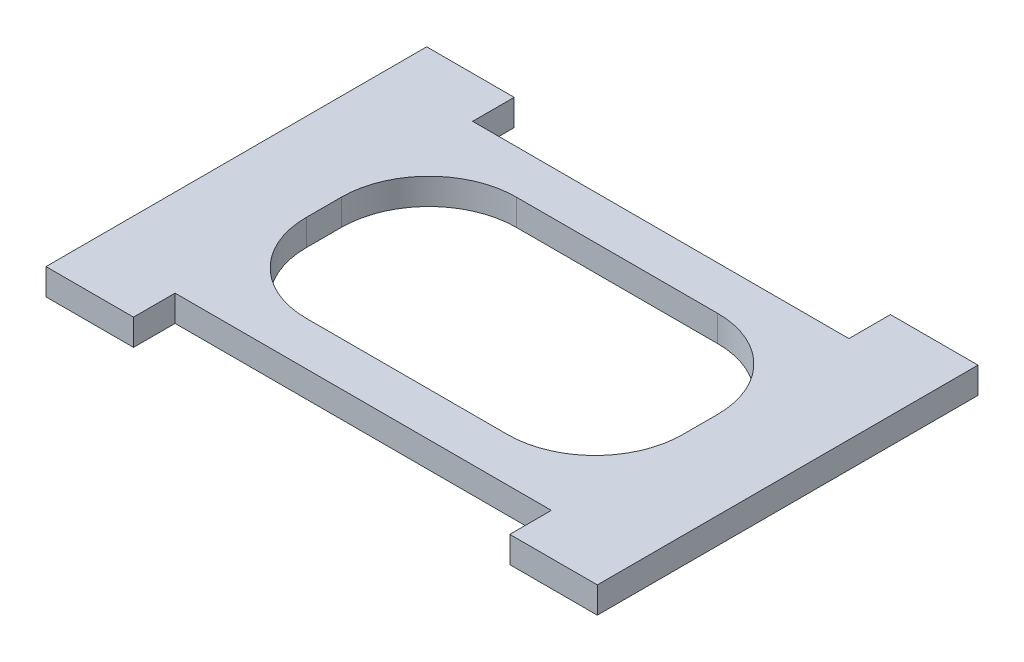
ISO-10303-21;
HEADER;
FILE_DESCRIPTION(('STEP AP214'),'2;1');
FILE_NAME('part.step','',(''),(''),'','','');
FILE_SCHEMA(('AUTOMOTIVE_DESIGN { 1 0 10303 214 1 1 1 1 }'));
ENDSEC;
DATA;
#1=APPLICATION_CONTEXT('core data for automotive mechanical design processes');
#2=APPLICATION_PROTOCOL_DEFINITION('international standard','automotive_design',2000,#1);
#3=PRODUCT_CONTEXT('',#1,'mechanical');
#4=PRODUCT('Part','Part','',(#3));
#5=PRODUCT_RELATED_PRODUCT_CATEGORY('part','',(#4));
#6=PRODUCT_DEFINITION_FORMATION('','',#4);
#7=PRODUCT_DEFINITION_CONTEXT('part definition',#1,'design');
#8=PRODUCT_DEFINITION('design','',#6,#7);
#9=PRODUCT_DEFINITION_SHAPE('','',#8);
#10=(LENGTH_UNIT() NAMED_UNIT(*) SI_UNIT(.MILLI.,.METRE.));
#11=(NAMED_UNIT(*) PLANE_ANGLE_UNIT() SI_UNIT($,.RADIAN.));
#12=(NAMED_UNIT(*) SI_UNIT($,.STERADIAN.) SOLID_ANGLE_UNIT());
#13=UNCERTAINTY_MEASURE_WITH_UNIT(LENGTH_MEASURE(1.E-05),#10,'distance_accuracy_value','');
#14=(GEOMETRIC_REPRESENTATION_CONTEXT(3) GLOBAL_UNCERTAINTY_ASSIGNED_CONTEXT((#13)) GLOBAL_UNIT_ASSIGNED_CONTEXT((#10,
#11,#12)) REPRESENTATION_CONTEXT('',''));
#15=CARTESIAN_POINT('',(0.,0.,0.));
#16=DIRECTION('',(0.,0.,1.));
#17=DIRECTION('',(1.,0.,0.));
#18=AXIS2_PLACEMENT_3D('',#15,#16,#17);
#19=CARTESIAN_POINT('',(2.75000000000301,3.,0.));
#20=DIRECTION('',(-1.,0.,0.));
#21=DIRECTION('',(0.,0.,1.));
#22=AXIS2_PLACEMENT_3D('',#19,#20,#21);
#23=PLANE('',#22);
#24=DIRECTION('',(0.,0.,-1.));
#25=VECTOR('',#24,1.);
#26=CARTESIAN_POINT('',(2.75000000000301,0.,0.));
#27=LINE('',#26,#25);
#28=CARTESIAN_POINT('',(2.75000000000301,0.,-16.9999999999987));
#29=VERTEX_POINT('',#28);
#30=CARTESIAN_POINT('',(2.75000000000301,0.,-21.7499999999987));
#31=VERTEX_POINT('',#30);
#32=EDGE_CURVE('E185',#29,#31,#27,.T.);
#33=ORIENTED_EDGE('',*,*,#32,.F.);
#34=DIRECTION('',(0.,-1.,0.));
#35=VECTOR('',#34,1.);
#36=CARTESIAN_POINT('',(2.75000000000301,3.,-16.9999999999987));
#37=LINE('',#36,#35);
#38=CARTESIAN_POINT('',(2.75000000000301,3.,-16.9999999999987));
#39=VERTEX_POINT('',#38);
#40=EDGE_CURVE('E179',#39,#29,#37,.T.);
#41=ORIENTED_EDGE('',*,*,#40,.F.);
#42=DIRECTION('',(0.,0.,-1.));
#43=VECTOR('',#42,1.);
#44=CARTESIAN_POINT('',(2.75000000000301,3.,0.));
#45=LINE('',#44,#43);
#46=CARTESIAN_POINT('',(2.75000000000301,3.,-21.7499999999987));
#47=VERTEX_POINT('',#46);
#48=EDGE_CURVE('E182',#39,#47,#45,.T.);
#49=ORIENTED_EDGE('',*,*,#48,.T.);
#50=DIRECTION('',(0.,-1.,0.));
#51=VECTOR('',#50,1.);
#52=CARTESIAN_POINT('',(2.75000000000301,3.,-21.7499999999987));
#53=LINE('',#52,#51);
#54=EDGE_CURVE('E249',#47,#31,#53,.T.);
#55=ORIENTED_EDGE('',*,*,#54,.T.);
#56=EDGE_LOOP('',(#33,#41,#49,#55));
#57=FACE_BOUND('',#56,.T.);
#58=ADVANCED_FACE('F40',(#57),#23,.T.);
#59=CARTESIAN_POINT('',(0.,3.,-16.9999999999987));
#60=DIRECTION('',(0.,0.,1.));
#61=DIRECTION('',(1.,0.,0.));
#62=AXIS2_PLACEMENT_3D('',#59,#60,#61);
#63=PLANE('',#62);
#64=DIRECTION('',(-1.,0.,0.));
#65=VECTOR('',#64,1.);
#66=CARTESIAN_POINT('',(0.,0.,-16.9999999999987));
#67=LINE('',#66,#65);
#68=CARTESIAN_POINT('',(-40.249999999997,0.,-16.9999999999987));
#69=VERTEX_POINT('',#68);
#70=EDGE_CURVE('E252',#29,#69,#67,.T.);
#71=ORIENTED_EDGE('',*,*,#70,.T.);
#72=DIRECTION('',(0.,-1.,0.));
#73=VECTOR('',#72,1.);
#74=CARTESIAN_POINT('',(-40.249999999997,3.,-16.9999999999987));
#75=LINE('',#74,#73);
#76=CARTESIAN_POINT('',(-40.249999999997,3.,-16.9999999999987));
#77=VERTEX_POINT('',#76);
#78=EDGE_CURVE('E190',#77,#69,#75,.T.);
#79=ORIENTED_EDGE('',*,*,#78,.F.);
#80=DIRECTION('',(-1.,0.,0.));
#81=VECTOR('',#80,1.);
#82=CARTESIAN_POINT('',(0.,3.,-16.9999999999987));
#83=LINE('',#82,#81);
#84=EDGE_CURVE('E193',#39,#77,#83,.T.);
#85=ORIENTED_EDGE('',*,*,#84,.F.);
#86=ORIENTED_EDGE('',*,*,#40,.T.);
#87=EDGE_LOOP('',(#71,#79,#85,#86));
#88=FACE_BOUND('',#87,.T.);
#89=ADVANCED_FACE('F194',(#88),#63,.F.);
#90=CARTESIAN_POINT('',(-40.249999999997,3.,0.));
#91=DIRECTION('',(-1.,0.,0.));
#92=DIRECTION('',(0.,0.,1.));
#93=AXIS2_PLACEMENT_3D('',#90,#91,#92);
#94=PLANE('',#93);
#95=DIRECTION('',(0.,0.,-1.));
#96=VECTOR('',#95,1.);
#97=CARTESIAN_POINT('',(-40.249999999997,0.,0.));
#98=LINE('',#97,#96);
#99=CARTESIAN_POINT('',(-40.249999999997,0.,-21.7499999999987));
#100=VERTEX_POINT('',#99);
#101=EDGE_CURVE('E256',#69,#100,#98,.T.);
#102=ORIENTED_EDGE('',*,*,#101,.T.);
#103=DIRECTION('',(0.,-1.,0.));
#104=VECTOR('',#103,1.);
#105=CARTESIAN_POINT('',(-40.249999999997,3.,-21.7499999999987));
#106=LINE('',#105,#104);
#107=CARTESIAN_POINT('',(-40.249999999997,3.,-21.7499999999987));
#108=VERTEX_POINT('',#107);
#109=EDGE_CURVE('E317',#108,#100,#106,.T.);
#110=ORIENTED_EDGE('',*,*,#109,.F.);
#111=DIRECTION('',(0.,0.,-1.));
#112=VECTOR('',#111,1.);
#113=CARTESIAN_POINT('',(-40.249999999997,3.,0.));
#114=LINE('',#113,#112);
#115=EDGE_CURVE('E199',#77,#108,#114,.T.);
#116=ORIENTED_EDGE('',*,*,#115,.F.);
#117=ORIENTED_EDGE('',*,*,#78,.T.);
#118=EDGE_LOOP('',(#102,#110,#116,#117));
#119=FACE_BOUND('',#118,.T.);
#120=ADVANCED_FACE('F428',(#119),#94,.F.);
#121=CARTESIAN_POINT('',(0.,3.,-21.7499999999987));
#122=DIRECTION('',(0.,0.,-1.));
#123=DIRECTION('',(-1.,0.,0.));
#124=AXIS2_PLACEMENT_3D('',#121,#122,#123);
#125=PLANE('',#124);
#126=DIRECTION('',(1.,0.,0.));
#127=VECTOR('',#126,1.);
#128=CARTESIAN_POINT('',(0.,0.,-21.7499999999987));
#129=LINE('',#128,#127);
#130=CARTESIAN_POINT('',(-50.249999999997,0.,-21.7499999999987));
#131=VERTEX_POINT('',#130);
#132=EDGE_CURVE('E260',#131,#100,#129,.T.);
#133=ORIENTED_EDGE('',*,*,#132,.F.);
#134=DIRECTION('',(0.,-1.,0.));
#135=VECTOR('',#134,1.);
#136=CARTESIAN_POINT('',(-50.249999999997,3.,-21.7499999999987));
#137=LINE('',#136,#135);
#138=CARTESIAN_POINT('',(-50.249999999997,3.,-21.7499999999987));
#139=VERTEX_POINT('',#138);
#140=EDGE_CURVE('E314',#139,#131,#137,.T.);
#141=ORIENTED_EDGE('',*,*,#140,.F.);
#142=DIRECTION('',(1.,0.,0.));
#143=VECTOR('',#142,1.);
#144=CARTESIAN_POINT('',(0.,3.,-21.7499999999987));
#145=LINE('',#144,#143);
#146=EDGE_CURVE('E218',#139,#108,#145,.T.);
#147=ORIENTED_EDGE('',*,*,#146,.T.);
#148=ORIENTED_EDGE('',*,*,#109,.T.);
#149=EDGE_LOOP('',(#133,#141,#147,#148));
#150=FACE_BOUND('',#149,.T.);
#151=ADVANCED_FACE('F487',(#150),#125,.T.);
#152=CARTESIAN_POINT('',(-50.249999999997,3.,0.));
#153=DIRECTION('',(-1.,0.,0.));
#154=DIRECTION('',(0.,0.,1.));
#155=AXIS2_PLACEMENT_3D('',#152,#153,#154);
#156=PLANE('',#155);
#157=DIRECTION('',(0.,0.,-1.));
#158=VECTOR('',#157,1.);
#159=CARTESIAN_POINT('',(-50.249999999997,0.,0.));
#160=LINE('',#159,#158);
#161=CARTESIAN_POINT('',(-50.249999999997,0.,21.7500000000004));
#162=VERTEX_POINT('',#161);
#163=EDGE_CURVE('E264',#162,#131,#160,.T.);
#164=ORIENTED_EDGE('',*,*,#163,.F.);
#165=DIRECTION('',(0.,-1.,0.));
#166=VECTOR('',#165,1.);
#167=CARTESIAN_POINT('',(-50.249999999997,3.,21.7500000000004));
#168=LINE('',#167,#166);
#169=CARTESIAN_POINT('',(-50.249999999997,3.,21.7500000000004));
#170=VERTEX_POINT('',#169);
#171=EDGE_CURVE('E311',#170,#162,#168,.T.);
#172=ORIENTED_EDGE('',*,*,#171,.F.);
#173=DIRECTION('',(0.,0.,-1.));
#174=VECTOR('',#173,1.);
#175=CARTESIAN_POINT('',(-50.249999999997,3.,0.));
#176=LINE('',#175,#174);
#177=EDGE_CURVE('E222',#170,#139,#176,.T.);
#178=ORIENTED_EDGE('',*,*,#177,.T.);
#179=ORIENTED_EDGE('',*,*,#140,.T.);
#180=EDGE_LOOP('',(#164,#172,#178,#179));
#181=FACE_BOUND('',#180,.T.);
#182=ADVANCED_FACE('F483',(#181),#156,.T.);
#183=CARTESIAN_POINT('',(0.,3.,21.7500000000004));
#184=DIRECTION('',(0.,0.,-1.));
#185=DIRECTION('',(-1.,0.,0.));
#186=AXIS2_PLACEMENT_3D('',#183,#184,#185);
#187=PLANE('',#186);
#188=DIRECTION('',(1.,0.,0.));
#189=VECTOR('',#188,1.);
#190=CARTESIAN_POINT('',(0.,0.,21.7500000000004));
#191=LINE('',#190,#189);
#192=CARTESIAN_POINT('',(-40.249999999997,0.,21.7500000000004));
#193=VERTEX_POINT('',#192);
#194=EDGE_CURVE('E268',#162,#193,#191,.T.);
#195=ORIENTED_EDGE('',*,*,#194,.T.);
#196=DIRECTION('',(0.,-1.,0.));
#197=VECTOR('',#196,1.);
#198=CARTESIAN_POINT('',(-40.249999999997,3.,21.7500000000004));
#199=LINE('',#198,#197);
#200=CARTESIAN_POINT('',(-40.249999999997,3.,21.7500000000004));
#201=VERTEX_POINT('',#200);
#202=EDGE_CURVE('E308',#201,#193,#199,.T.);
#203=ORIENTED_EDGE('',*,*,#202,.F.);
#204=DIRECTION('',(1.,0.,0.));
#205=VECTOR('',#204,1.);
#206=CARTESIAN_POINT('',(0.,3.,21.7500000000004));
#207=LINE('',#206,#205);
#208=EDGE_CURVE('E226',#170,#201,#207,.T.);
#209=ORIENTED_EDGE('',*,*,#208,.F.);
#210=ORIENTED_EDGE('',*,*,#171,.T.);
#211=EDGE_LOOP('',(#195,#203,#209,#210));
#212=FACE_BOUND('',#211,.T.);
#213=ADVANCED_FACE('F479',(#212),#187,.F.);
#214=CARTESIAN_POINT('',(-40.249999999997,3.,0.));
#215=DIRECTION('',(1.,0.,0.));
#216=DIRECTION('',(0.,0.,-1.));
#217=AXIS2_PLACEMENT_3D('',#214,#215,#216);
#218=PLANE('',#217);
#219=DIRECTION('',(0.,0.,1.));
#220=VECTOR('',#219,1.);
#221=CARTESIAN_POINT('',(-40.249999999997,0.,0.));
#222=LINE('',#221,#220);
#223=CARTESIAN_POINT('',(-40.249999999997,0.,17.0000000000004));
#224=VERTEX_POINT('',#223);
#225=EDGE_CURVE('E272',#224,#193,#222,.T.);
#226=ORIENTED_EDGE('',*,*,#225,.F.);
#227=DIRECTION('',(0.,-1.,0.));
#228=VECTOR('',#227,1.);
#229=CARTESIAN_POINT('',(-40.249999999997,3.,17.0000000000004));
#230=LINE('',#229,#228);
#231=CARTESIAN_POINT('',(-40.249999999997,3.,17.0000000000004));
#232=VERTEX_POINT('',#231);
#233=EDGE_CURVE('E305',#232,#224,#230,.T.);
#234=ORIENTED_EDGE('',*,*,#233,.F.);
#235=DIRECTION('',(0.,0.,1.));
#236=VECTOR('',#235,1.);
#237=CARTESIAN_POINT('',(-40.249999999997,3.,0.));
#238=LINE('',#237,#236);
#239=EDGE_CURVE('E229',#232,#201,#238,.T.);
#240=ORIENTED_EDGE('',*,*,#239,.T.);
#241=ORIENTED_EDGE('',*,*,#202,.T.);
#242=EDGE_LOOP('',(#226,#234,#240,#241));
#243=FACE_BOUND('',#242,.T.);
#244=ADVANCED_FACE('F475',(#243),#218,.T.);
#245=CARTESIAN_POINT('',(0.,3.,17.0000000000003));
#246=DIRECTION('',(0.,0.,1.));
#247=DIRECTION('',(1.,0.,0.));
#248=AXIS2_PLACEMENT_3D('',#245,#246,#247);
#249=PLANE('',#248);
#250=DIRECTION('',(-1.,0.,0.));
#251=VECTOR('',#250,1.);
#252=CARTESIAN_POINT('',(0.,0.,17.0000000000003));
#253=LINE('',#252,#251);
#254=CARTESIAN_POINT('',(2.75000000000299,0.,17.0000000000003));
#255=VERTEX_POINT('',#254);
#256=EDGE_CURVE('E276',#255,#224,#253,.T.);
#257=ORIENTED_EDGE('',*,*,#256,.F.);
#258=DIRECTION('',(0.,-1.,0.));
#259=VECTOR('',#258,1.);
#260=CARTESIAN_POINT('',(2.75000000000299,3.,17.0000000000003));
#261=LINE('',#260,#259);
#262=CARTESIAN_POINT('',(2.75000000000299,3.,17.0000000000003));
#263=VERTEX_POINT('',#262);
#264=EDGE_CURVE('E302',#263,#255,#261,.T.);
#265=ORIENTED_EDGE('',*,*,#264,.F.);
#266=DIRECTION('',(-1.,0.,0.));
#267=VECTOR('',#266,1.);
#268=CARTESIAN_POINT('',(0.,3.,17.0000000000003));
#269=LINE('',#268,#267);
#270=EDGE_CURVE('E233',#263,#232,#269,.T.);
#271=ORIENTED_EDGE('',*,*,#270,.T.);
#272=ORIENTED_EDGE('',*,*,#233,.T.);
#273=EDGE_LOOP('',(#257,#265,#271,#272));
#274=FACE_BOUND('',#273,.T.);
#275=ADVANCED_FACE('F471',(#274),#249,.T.);
#276=CARTESIAN_POINT('',(2.75000000000298,3.,0.));
#277=DIRECTION('',(1.,0.,0.));
#278=DIRECTION('',(0.,0.,-1.));
#279=AXIS2_PLACEMENT_3D('',#276,#277,#278);
#280=PLANE('',#279);
#281=DIRECTION('',(0.,0.,1.));
#282=VECTOR('',#281,1.);
#283=CARTESIAN_POINT('',(2.75000000000298,0.,0.));
#284=LINE('',#283,#282);
#285=CARTESIAN_POINT('',(2.75000000000299,0.,21.7500000000003));
#286=VERTEX_POINT('',#285);
#287=EDGE_CURVE('E280',#255,#286,#284,.T.);
#288=ORIENTED_EDGE('',*,*,#287,.T.);
#289=DIRECTION('',(0.,-1.,0.));
#290=VECTOR('',#289,1.);
#291=CARTESIAN_POINT('',(2.75000000000299,3.,21.7500000000003));
#292=LINE('',#291,#290);
#293=CARTESIAN_POINT('',(2.75000000000299,3.,21.7500000000003));
#294=VERTEX_POINT('',#293);
#295=EDGE_CURVE('E298',#294,#286,#292,.T.);
#296=ORIENTED_EDGE('',*,*,#295,.F.);
#297=DIRECTION('',(0.,0.,1.));
#298=VECTOR('',#297,1.);
#299=CARTESIAN_POINT('',(2.75000000000298,3.,0.));
#300=LINE('',#299,#298);
#301=EDGE_CURVE('E237',#263,#294,#300,.T.);
#302=ORIENTED_EDGE('',*,*,#301,.F.);
#303=ORIENTED_EDGE('',*,*,#264,.T.);
#304=EDGE_LOOP('',(#288,#296,#302,#303));
#305=FACE_BOUND('',#304,.T.);
#306=ADVANCED_FACE('F467',(#305),#280,.F.);
#307=CARTESIAN_POINT('',(0.,3.,21.7500000000003));
#308=DIRECTION('',(0.,0.,-1.));
#309=DIRECTION('',(-1.,0.,0.));
#310=AXIS2_PLACEMENT_3D('',#307,#308,#309);
#311=PLANE('',#310);
#312=DIRECTION('',(1.,0.,0.));
#313=VECTOR('',#312,1.);
#314=CARTESIAN_POINT('',(0.,0.,21.7500000000003));
#315=LINE('',#314,#313);
#316=CARTESIAN_POINT('',(12.750000000003,0.,21.7500000000003));
#317=VERTEX_POINT('',#316);
#318=EDGE_CURVE('E283',#286,#317,#315,.T.);
#319=ORIENTED_EDGE('',*,*,#318,.T.);
#320=DIRECTION('',(0.,-1.,0.));
#321=VECTOR('',#320,1.);
#322=CARTESIAN_POINT('',(12.750000000003,3.,21.7500000000003));
#323=LINE('',#322,#321);
#324=CARTESIAN_POINT('',(12.750000000003,3.,21.7500000000003));
#325=VERTEX_POINT('',#324);
#326=EDGE_CURVE('E295',#325,#317,#323,.T.);
#327=ORIENTED_EDGE('',*,*,#326,.F.);
#328=DIRECTION('',(1.,0.,0.));
#329=VECTOR('',#328,1.);
#330=CARTESIAN_POINT('',(0.,3.,21.7500000000003));
#331=LINE('',#330,#329);
#332=EDGE_CURVE('E240',#294,#325,#331,.T.);
#333=ORIENTED_EDGE('',*,*,#332,.F.);
#334=ORIENTED_EDGE('',*,*,#295,.T.);
#335=EDGE_LOOP('',(#319,#327,#333,#334));
#336=FACE_BOUND('',#335,.T.);
#337=ADVANCED_FACE('F463',(#336),#311,.F.);
#338=CARTESIAN_POINT('',(12.750000000003,3.,0.));
#339=DIRECTION('',(1.,0.,0.));
#340=DIRECTION('',(0.,0.,-1.));
#341=AXIS2_PLACEMENT_3D('',#338,#339,#340);
#342=PLANE('',#341);
#343=DIRECTION('',(0.,0.,1.));
#344=VECTOR('',#343,1.);
#345=CARTESIAN_POINT('',(12.750000000003,0.,0.));
#346=LINE('',#345,#344);
#347=CARTESIAN_POINT('',(12.750000000003,0.,-21.7499999999987));
#348=VERTEX_POINT('',#347);
#349=EDGE_CURVE('E210',#348,#317,#346,.T.);
#350=ORIENTED_EDGE('',*,*,#349,.F.);
#351=DIRECTION('',(0.,-1.,0.));
#352=VECTOR('',#351,1.);
#353=CARTESIAN_POINT('',(12.750000000003,3.,-21.7499999999987));
#354=LINE('',#353,#352);
#355=CARTESIAN_POINT('',(12.750000000003,3.,-21.7499999999987));
#356=VERTEX_POINT('',#355);
#357=EDGE_CURVE('E292',#356,#348,#354,.T.);
#358=ORIENTED_EDGE('',*,*,#357,.F.);
#359=DIRECTION('',(0.,0.,1.));
#360=VECTOR('',#359,1.);
#361=CARTESIAN_POINT('',(12.750000000003,3.,0.));
#362=LINE('',#361,#360);
#363=EDGE_CURVE('E243',#356,#325,#362,.T.);
#364=ORIENTED_EDGE('',*,*,#363,.T.);
#365=ORIENTED_EDGE('',*,*,#326,.T.);
#366=EDGE_LOOP('',(#350,#358,#364,#365));
#367=FACE_BOUND('',#366,.T.);
#368=ADVANCED_FACE('F459',(#367),#342,.T.);
#369=CARTESIAN_POINT('',(0.,3.,-21.7499999999987));
#370=DIRECTION('',(0.,0.,-1.));
#371=DIRECTION('',(-1.,0.,0.));
#372=AXIS2_PLACEMENT_3D('',#369,#370,#371);
#373=PLANE('',#372);
#374=DIRECTION('',(1.,0.,0.));
#375=VECTOR('',#374,1.);
#376=CARTESIAN_POINT('',(0.,0.,-21.7499999999987));
#377=LINE('',#376,#375);
#378=EDGE_CURVE('E206',#31,#348,#377,.T.);
#379=ORIENTED_EDGE('',*,*,#378,.F.);
#380=ORIENTED_EDGE('',*,*,#54,.F.);
#381=DIRECTION('',(1.,0.,0.));
#382=VECTOR('',#381,1.);
#383=CARTESIAN_POINT('',(0.,3.,-21.7499999999987));
#384=LINE('',#383,#382);
#385=EDGE_CURVE('E204',#47,#356,#384,.T.);
#386=ORIENTED_EDGE('',*,*,#385,.T.);
#387=ORIENTED_EDGE('',*,*,#357,.T.);
#388=EDGE_LOOP('',(#379,#380,#386,#387));
#389=FACE_BOUND('',#388,.T.);
#390=ADVANCED_FACE('F454',(#389),#373,.T.);
#391=CARTESIAN_POINT('',(0.,3.,0.));
#392=DIRECTION('',(0.,1.,0.));
#393=DIRECTION('',(0.,0.,1.));
#394=AXIS2_PLACEMENT_3D('',#391,#392,#393);
#395=PLANE('',#394);
#396=DIRECTION('',(1.,0.,0.));
#397=VECTOR('',#396,1.);
#398=CARTESIAN_POINT('',(-40.2499999999993,3.,11.9999999999998));
#399=LINE('',#398,#397);
#400=CARTESIAN_POINT('',(-30.2499999999993,3.,11.9999999999998));
#401=VERTEX_POINT('',#400);
#402=CARTESIAN_POINT('',(-7.24999999999926,3.,11.9999999999998));
#403=VERTEX_POINT('',#402);
#404=EDGE_CURVE('E369',#401,#403,#399,.T.);
#405=ORIENTED_EDGE('',*,*,#404,.F.);
#406=CARTESIAN_POINT('',(-30.2499999999993,3.,1.99999999999985));
#407=DIRECTION('',(0.,1.,0.));
#408=DIRECTION('',(0.,0.,1.));
#409=AXIS2_PLACEMENT_3D('',#406,#407,#408);
#410=CIRCLE('',#409,10.);
#411=CARTESIAN_POINT('',(-40.2499999999993,3.,1.99999999999986));
#412=VERTEX_POINT('',#411);
#413=EDGE_CURVE('E49',#401,#412,#410,.F.);
#414=ORIENTED_EDGE('',*,*,#413,.T.);
#415=DIRECTION('',(0.,0.,1.));
#416=VECTOR('',#415,1.);
#417=CARTESIAN_POINT('',(-40.2499999999993,3.,-11.9999999999997));
#418=LINE('',#417,#416);
#419=CARTESIAN_POINT('',(-40.2499999999993,3.,-1.99999999999969));
#420=VERTEX_POINT('',#419);
#421=EDGE_CURVE('E213',#420,#412,#418,.T.);
#422=ORIENTED_EDGE('',*,*,#421,.F.);
#423=CARTESIAN_POINT('',(-30.2499999999993,3.,-1.99999999999969));
#424=DIRECTION('',(0.,1.,0.));
#425=DIRECTION('',(0.,0.,1.));
#426=AXIS2_PLACEMENT_3D('',#423,#424,#425);
#427=CIRCLE('',#426,10.);
#428=CARTESIAN_POINT('',(-30.2499999999993,3.,-11.9999999999997));
#429=VERTEX_POINT('',#428);
#430=EDGE_CURVE('E360',#420,#429,#427,.F.);
#431=ORIENTED_EDGE('',*,*,#430,.T.);
#432=DIRECTION('',(1.,0.,0.));
#433=VECTOR('',#432,1.);
#434=CARTESIAN_POINT('',(-40.2499999999993,3.,-11.9999999999997));
#435=LINE('',#434,#433);
#436=CARTESIAN_POINT('',(-7.24999999999926,3.,-11.9999999999997));
#437=VERTEX_POINT('',#436);
#438=EDGE_CURVE('E376',#429,#437,#435,.T.);
#439=ORIENTED_EDGE('',*,*,#438,.T.);
#440=CARTESIAN_POINT('',(-7.24999999999926,3.,-1.99999999999969));
#441=DIRECTION('',(0.,1.,0.));
#442=DIRECTION('',(0.,0.,1.));
#443=AXIS2_PLACEMENT_3D('',#440,#441,#442);
#444=CIRCLE('',#443,10.);
#445=CARTESIAN_POINT('',(2.75000000000073,3.,-1.99999999999969));
#446=VERTEX_POINT('',#445);
#447=EDGE_CURVE('E354',#437,#446,#444,.F.);
#448=ORIENTED_EDGE('',*,*,#447,.T.);
#449=DIRECTION('',(0.,0.,1.));
#450=VECTOR('',#449,1.);
#451=CARTESIAN_POINT('',(2.75000000000073,3.,-11.9999999999997));
#452=LINE('',#451,#450);
#453=CARTESIAN_POINT('',(2.75000000000073,3.,1.99999999999985));
#454=VERTEX_POINT('',#453);
#455=EDGE_CURVE('E401',#446,#454,#452,.T.);
#456=ORIENTED_EDGE('',*,*,#455,.T.);
#457=CARTESIAN_POINT('',(-7.24999999999927,3.,1.99999999999985));
#458=DIRECTION('',(0.,1.,0.));
#459=DIRECTION('',(0.,0.,1.));
#460=AXIS2_PLACEMENT_3D('',#457,#458,#459);
#461=CIRCLE('',#460,10.);
#462=EDGE_CURVE('E348',#454,#403,#461,.F.);
#463=ORIENTED_EDGE('',*,*,#462,.T.);
#464=EDGE_LOOP('',(#405,#414,#422,#431,#439,#448,#456,#463));
#465=FACE_BOUND('',#464,.T.);
#466=ORIENTED_EDGE('',*,*,#48,.F.);
#467=ORIENTED_EDGE('',*,*,#84,.T.);
#468=ORIENTED_EDGE('',*,*,#115,.T.);
#469=ORIENTED_EDGE('',*,*,#146,.F.);
#470=ORIENTED_EDGE('',*,*,#177,.F.);
#471=ORIENTED_EDGE('',*,*,#208,.T.);
#472=ORIENTED_EDGE('',*,*,#239,.F.);
#473=ORIENTED_EDGE('',*,*,#270,.F.);
#474=ORIENTED_EDGE('',*,*,#301,.T.);
#475=ORIENTED_EDGE('',*,*,#332,.T.);
#476=ORIENTED_EDGE('',*,*,#363,.F.);
#477=ORIENTED_EDGE('',*,*,#385,.F.);
#478=EDGE_LOOP('',(#466,#467,#468,#469,#470,#471,#472,#473,#474,#475,#476,#477));
#479=FACE_BOUND('',#478,.T.);
#480=ADVANCED_FACE('F201',(#465,#479),#395,.T.);
#481=CARTESIAN_POINT('',(0.,0.,0.));
#482=DIRECTION('',(0.,1.,0.));
#483=DIRECTION('',(0.,0.,1.));
#484=AXIS2_PLACEMENT_3D('',#481,#482,#483);
#485=PLANE('',#484);
#486=DIRECTION('',(1.,0.,0.));
#487=VECTOR('',#486,1.);
#488=CARTESIAN_POINT('',(-40.2499999999993,0.,-11.9999999999997));
#489=LINE('',#488,#487);
#490=CARTESIAN_POINT('',(-30.2499999999993,0.,-11.9999999999997));
#491=VERTEX_POINT('',#490);
#492=CARTESIAN_POINT('',(-7.24999999999926,0.,-11.9999999999997));
#493=VERTEX_POINT('',#492);
#494=EDGE_CURVE('E391',#491,#493,#489,.T.);
#495=ORIENTED_EDGE('',*,*,#494,.F.);
#496=CARTESIAN_POINT('',(-30.2499999999993,0.,-1.99999999999969));
#497=DIRECTION('',(0.,1.,0.));
#498=DIRECTION('',(0.,0.,1.));
#499=AXIS2_PLACEMENT_3D('',#496,#497,#498);
#500=CIRCLE('',#499,10.);
#501=CARTESIAN_POINT('',(-40.2499999999993,0.,-1.99999999999969));
#502=VERTEX_POINT('',#501);
#503=EDGE_CURVE('E63',#491,#502,#500,.T.);
#504=ORIENTED_EDGE('',*,*,#503,.T.);
#505=DIRECTION('',(0.,0.,1.));
#506=VECTOR('',#505,1.);
#507=CARTESIAN_POINT('',(-40.2499999999993,0.,-11.9999999999997));
#508=LINE('',#507,#506);
#509=CARTESIAN_POINT('',(-40.2499999999993,0.,1.99999999999986));
#510=VERTEX_POINT('',#509);
#511=EDGE_CURVE('E253',#502,#510,#508,.T.);
#512=ORIENTED_EDGE('',*,*,#511,.T.);
#513=CARTESIAN_POINT('',(-30.2499999999993,0.,1.99999999999985));
#514=DIRECTION('',(0.,1.,0.));
#515=DIRECTION('',(0.,0.,1.));
#516=AXIS2_PLACEMENT_3D('',#513,#514,#515);
#517=CIRCLE('',#516,10.);
#518=CARTESIAN_POINT('',(-30.2499999999993,0.,11.9999999999998));
#519=VERTEX_POINT('',#518);
#520=EDGE_CURVE('E11',#510,#519,#517,.T.);
#521=ORIENTED_EDGE('',*,*,#520,.T.);
#522=DIRECTION('',(1.,0.,0.));
#523=VECTOR('',#522,1.);
#524=CARTESIAN_POINT('',(-40.2499999999993,0.,11.9999999999998));
#525=LINE('',#524,#523);
#526=CARTESIAN_POINT('',(-7.24999999999926,0.,11.9999999999998));
#527=VERTEX_POINT('',#526);
#528=EDGE_CURVE('E375',#519,#527,#525,.T.);
#529=ORIENTED_EDGE('',*,*,#528,.T.);
#530=CARTESIAN_POINT('',(-7.24999999999927,0.,1.99999999999985));
#531=DIRECTION('',(0.,1.,0.));
#532=DIRECTION('',(0.,0.,1.));
#533=AXIS2_PLACEMENT_3D('',#530,#531,#532);
#534=CIRCLE('',#533,10.);
#535=CARTESIAN_POINT('',(2.75000000000073,0.,1.99999999999985));
#536=VERTEX_POINT('',#535);
#537=EDGE_CURVE('E351',#527,#536,#534,.T.);
#538=ORIENTED_EDGE('',*,*,#537,.T.);
#539=DIRECTION('',(0.,0.,1.));
#540=VECTOR('',#539,1.);
#541=CARTESIAN_POINT('',(2.75000000000073,0.,-11.9999999999997));
#542=LINE('',#541,#540);
#543=CARTESIAN_POINT('',(2.75000000000073,0.,-1.99999999999969));
#544=VERTEX_POINT('',#543);
#545=EDGE_CURVE('E387',#544,#536,#542,.T.);
#546=ORIENTED_EDGE('',*,*,#545,.F.);
#547=CARTESIAN_POINT('',(-7.24999999999926,0.,-1.99999999999969));
#548=DIRECTION('',(0.,1.,0.));
#549=DIRECTION('',(0.,0.,1.));
#550=AXIS2_PLACEMENT_3D('',#547,#548,#549);
#551=CIRCLE('',#550,10.);
#552=EDGE_CURVE('E357',#544,#493,#551,.T.);
#553=ORIENTED_EDGE('',*,*,#552,.T.);
#554=EDGE_LOOP('',(#495,#504,#512,#521,#529,#538,#546,#553));
#555=FACE_BOUND('',#554,.T.);
#556=ORIENTED_EDGE('',*,*,#32,.T.);
#557=ORIENTED_EDGE('',*,*,#378,.T.);
#558=ORIENTED_EDGE('',*,*,#349,.T.);
#559=ORIENTED_EDGE('',*,*,#318,.F.);
#560=ORIENTED_EDGE('',*,*,#287,.F.);
#561=ORIENTED_EDGE('',*,*,#256,.T.);
#562=ORIENTED_EDGE('',*,*,#225,.T.);
#563=ORIENTED_EDGE('',*,*,#194,.F.);
#564=ORIENTED_EDGE('',*,*,#163,.T.);
#565=ORIENTED_EDGE('',*,*,#132,.T.);
#566=ORIENTED_EDGE('',*,*,#101,.F.);
#567=ORIENTED_EDGE('',*,*,#70,.F.);
#568=EDGE_LOOP('',(#556,#557,#558,#559,#560,#561,#562,#563,#564,#565,#566,#567));
#569=FACE_BOUND('',#568,.T.);
#570=ADVANCED_FACE('F380',(#555,#569),#485,.F.);
#571=CARTESIAN_POINT('',(-40.2499999999993,0.,11.9999999999998));
#572=DIRECTION('',(0.,0.,1.));
#573=DIRECTION('',(1.,0.,0.));
#574=AXIS2_PLACEMENT_3D('',#571,#572,#573);
#575=PLANE('',#574);
#576=ORIENTED_EDGE('',*,*,#404,.T.);
#577=DIRECTION('',(0.,1.,0.));
#578=VECTOR('',#577,1.);
#579=CARTESIAN_POINT('',(-7.24999999999926,0.,11.9999999999998));
#580=LINE('',#579,#578);
#581=EDGE_CURVE('E332',#403,#527,#580,.F.);
#582=ORIENTED_EDGE('',*,*,#581,.T.);
#583=ORIENTED_EDGE('',*,*,#528,.F.);
#584=DIRECTION('',(0.,1.,0.));
#585=VECTOR('',#584,1.);
#586=CARTESIAN_POINT('',(-30.2499999999993,3.,11.9999999999998));
#587=LINE('',#586,#585);
#588=EDGE_CURVE('E328',#519,#401,#587,.T.);
#589=ORIENTED_EDGE('',*,*,#588,.T.);
#590=EDGE_LOOP('',(#576,#582,#583,#589));
#591=FACE_BOUND('',#590,.T.);
#592=ADVANCED_FACE('F384',(#591),#575,.F.);
#593=CARTESIAN_POINT('',(-40.2499999999993,0.,-11.9999999999997));
#594=DIRECTION('',(-1.,0.,0.));
#595=DIRECTION('',(0.,0.,1.));
#596=AXIS2_PLACEMENT_3D('',#593,#594,#595);
#597=PLANE('',#596);
#598=ORIENTED_EDGE('',*,*,#511,.F.);
#599=DIRECTION('',(0.,1.,0.));
#600=VECTOR('',#599,1.);
#601=CARTESIAN_POINT('',(-40.2499999999993,0.,-1.99999999999969));
#602=LINE('',#601,#600);
#603=EDGE_CURVE('E344',#502,#420,#602,.T.);
#604=ORIENTED_EDGE('',*,*,#603,.T.);
#605=ORIENTED_EDGE('',*,*,#421,.T.);
#606=DIRECTION('',(0.,1.,0.));
#607=VECTOR('',#606,1.);
#608=CARTESIAN_POINT('',(-40.2499999999993,0.,1.99999999999986));
#609=LINE('',#608,#607);
#610=EDGE_CURVE('E56',#412,#510,#609,.F.);
#611=ORIENTED_EDGE('',*,*,#610,.T.);
#612=EDGE_LOOP('',(#598,#604,#605,#611));
#613=FACE_BOUND('',#612,.T.);
#614=ADVANCED_FACE('F372',(#613),#597,.F.);
#615=CARTESIAN_POINT('',(-40.2499999999993,0.,-11.9999999999997));
#616=DIRECTION('',(0.,0.,1.));
#617=DIRECTION('',(1.,0.,0.));
#618=AXIS2_PLACEMENT_3D('',#615,#616,#617);
#619=PLANE('',#618);
#620=ORIENTED_EDGE('',*,*,#494,.T.);
#621=DIRECTION('',(0.,1.,0.));
#622=VECTOR('',#621,1.);
#623=CARTESIAN_POINT('',(-7.24999999999926,3.,-11.9999999999997));
#624=LINE('',#623,#622);
#625=EDGE_CURVE('E338',#493,#437,#624,.T.);
#626=ORIENTED_EDGE('',*,*,#625,.T.);
#627=ORIENTED_EDGE('',*,*,#438,.F.);
#628=DIRECTION('',(0.,1.,0.));
#629=VECTOR('',#628,1.);
#630=CARTESIAN_POINT('',(-30.2499999999993,0.,-11.9999999999997));
#631=LINE('',#630,#629);
#632=EDGE_CURVE('E335',#429,#491,#631,.F.);
#633=ORIENTED_EDGE('',*,*,#632,.T.);
#634=EDGE_LOOP('',(#620,#626,#627,#633));
#635=FACE_BOUND('',#634,.T.);
#636=ADVANCED_FACE('F410',(#635),#619,.T.);
#637=CARTESIAN_POINT('',(2.75000000000073,0.,-11.9999999999997));
#638=DIRECTION('',(-1.,0.,0.));
#639=DIRECTION('',(0.,0.,1.));
#640=AXIS2_PLACEMENT_3D('',#637,#638,#639);
#641=PLANE('',#640);
#642=ORIENTED_EDGE('',*,*,#545,.T.);
#643=DIRECTION('',(0.,1.,0.));
#644=VECTOR('',#643,1.);
#645=CARTESIAN_POINT('',(2.75000000000073,0.,1.99999999999985));
#646=LINE('',#645,#644);
#647=EDGE_CURVE('E324',#536,#454,#646,.T.);
#648=ORIENTED_EDGE('',*,*,#647,.T.);
#649=ORIENTED_EDGE('',*,*,#455,.F.);
#650=DIRECTION('',(0.,1.,0.));
#651=VECTOR('',#650,1.);
#652=CARTESIAN_POINT('',(2.75000000000073,0.,-1.99999999999969));
#653=LINE('',#652,#651);
#654=EDGE_CURVE('E189',#446,#544,#653,.F.);
#655=ORIENTED_EDGE('',*,*,#654,.T.);
#656=EDGE_LOOP('',(#642,#648,#649,#655));
#657=FACE_BOUND('',#656,.T.);
#658=ADVANCED_FACE('F433',(#657),#641,.T.);
#659=CARTESIAN_POINT('',(-7.24999999999927,0.,1.99999999999985));
#660=DIRECTION('',(0.,1.,0.));
#661=DIRECTION('',(0.,0.,1.));
#662=AXIS2_PLACEMENT_3D('',#659,#660,#661);
#663=CYLINDRICAL_SURFACE('',#662,10.);
#664=ORIENTED_EDGE('',*,*,#537,.F.);
#665=ORIENTED_EDGE('',*,*,#581,.F.);
#666=ORIENTED_EDGE('',*,*,#462,.F.);
#667=ORIENTED_EDGE('',*,*,#647,.F.);
#668=EDGE_LOOP('',(#664,#665,#666,#667));
#669=FACE_BOUND('',#668,.T.);
#670=ADVANCED_FACE('F420',(#669),#663,.F.);
#671=CARTESIAN_POINT('',(-7.24999999999926,0.,-1.99999999999969));
#672=DIRECTION('',(0.,-1.,0.));
#673=DIRECTION('',(0.,0.,-1.));
#674=AXIS2_PLACEMENT_3D('',#671,#672,#673);
#675=CYLINDRICAL_SURFACE('',#674,10.);
#676=ORIENTED_EDGE('',*,*,#552,.F.);
#677=ORIENTED_EDGE('',*,*,#654,.F.);
#678=ORIENTED_EDGE('',*,*,#447,.F.);
#679=ORIENTED_EDGE('',*,*,#625,.F.);
#680=EDGE_LOOP('',(#676,#677,#678,#679));
#681=FACE_BOUND('',#680,.T.);
#682=ADVANCED_FACE('F415',(#681),#675,.F.);
#683=CARTESIAN_POINT('',(-30.2499999999993,0.,-1.99999999999969));
#684=DIRECTION('',(0.,1.,0.));
#685=DIRECTION('',(0.,0.,1.));
#686=AXIS2_PLACEMENT_3D('',#683,#684,#685);
#687=CYLINDRICAL_SURFACE('',#686,10.);
#688=ORIENTED_EDGE('',*,*,#503,.F.);
#689=ORIENTED_EDGE('',*,*,#632,.F.);
#690=ORIENTED_EDGE('',*,*,#430,.F.);
#691=ORIENTED_EDGE('',*,*,#603,.F.);
#692=EDGE_LOOP('',(#688,#689,#690,#691));
#693=FACE_BOUND('',#692,.T.);
#694=ADVANCED_FACE('F413',(#693),#687,.F.);
#695=CARTESIAN_POINT('',(-30.2499999999993,0.,1.99999999999985));
#696=DIRECTION('',(0.,-1.,0.));
#697=DIRECTION('',(0.,0.,-1.));
#698=AXIS2_PLACEMENT_3D('',#695,#696,#697);
#699=CYLINDRICAL_SURFACE('',#698,10.);
#700=ORIENTED_EDGE('',*,*,#520,.F.);
#701=ORIENTED_EDGE('',*,*,#610,.F.);
#702=ORIENTED_EDGE('',*,*,#413,.F.);
#703=ORIENTED_EDGE('',*,*,#588,.F.);
#704=EDGE_LOOP('',(#700,#701,#702,#703));
#705=FACE_BOUND('',#704,.T.);
#706=ADVANCED_FACE('F42',(#705),#699,.F.);
#707=CLOSED_SHELL('',(#58,#89,#120,#151,#182,#213,#244,#275,#306,#337,#368,#390,#480,#570,#592,
#614,#636,#658,#670,#682,#694,#706));
#708=MANIFOLD_SOLID_BREP('B2',#707);
#709=ADVANCED_BREP_SHAPE_REPRESENTATION('',(#18,#708),#14);
#710=SHAPE_DEFINITION_REPRESENTATION(#9,#709);
ENDSEC;
END-ISO-10303-21;
